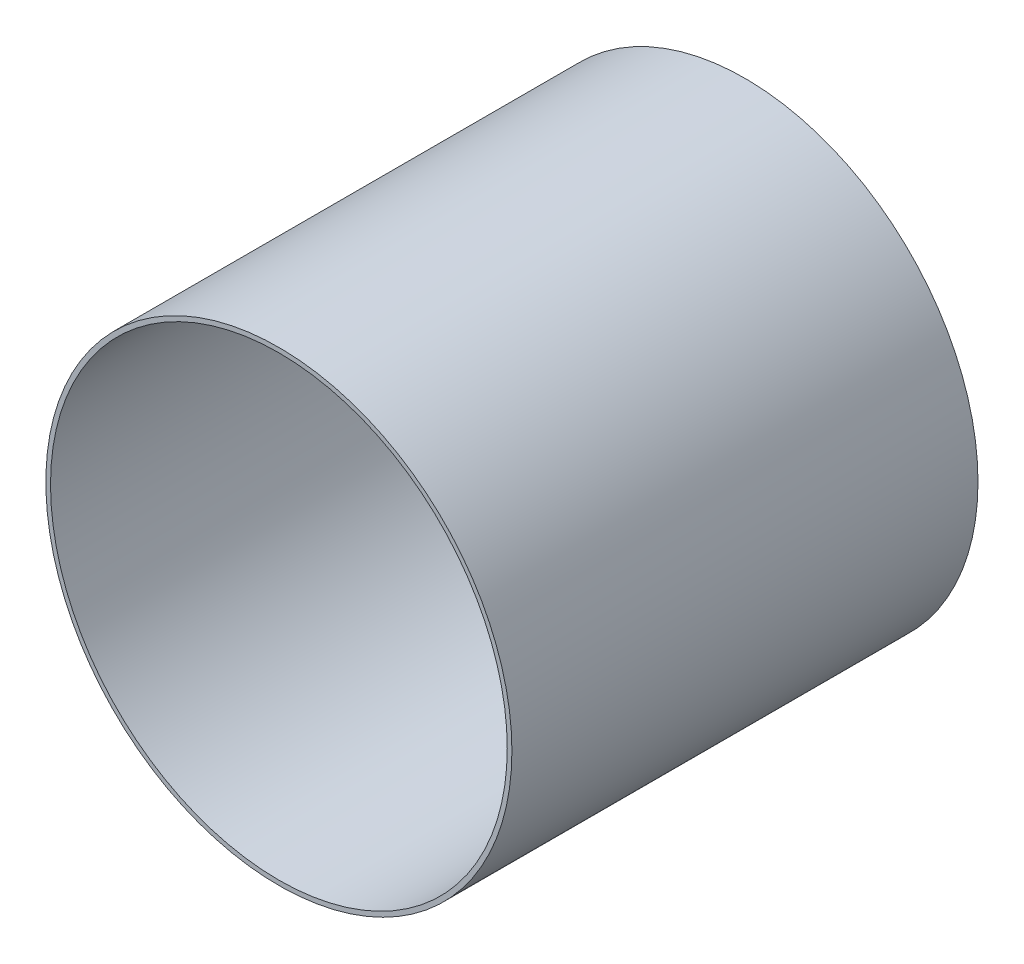
ISO-10303-21;
HEADER;
FILE_DESCRIPTION(('STEP AP214'),'2;1');
FILE_NAME('part.step','',(''),(''),'','','');
FILE_SCHEMA(('AUTOMOTIVE_DESIGN { 1 0 10303 214 1 1 1 1 }'));
ENDSEC;
DATA;
#1=APPLICATION_CONTEXT('core data for automotive mechanical design processes');
#2=APPLICATION_PROTOCOL_DEFINITION('international standard','automotive_design',2000,#1);
#3=PRODUCT_CONTEXT('',#1,'mechanical');
#4=PRODUCT('Part','Part','',(#3));
#5=PRODUCT_RELATED_PRODUCT_CATEGORY('part','',(#4));
#6=PRODUCT_DEFINITION_FORMATION('','',#4);
#7=PRODUCT_DEFINITION_CONTEXT('part definition',#1,'design');
#8=PRODUCT_DEFINITION('design','',#6,#7);
#9=PRODUCT_DEFINITION_SHAPE('','',#8);
#10=(LENGTH_UNIT() NAMED_UNIT(*) SI_UNIT(.MILLI.,.METRE.));
#11=(NAMED_UNIT(*) PLANE_ANGLE_UNIT() SI_UNIT($,.RADIAN.));
#12=(NAMED_UNIT(*) SI_UNIT($,.STERADIAN.) SOLID_ANGLE_UNIT());
#13=UNCERTAINTY_MEASURE_WITH_UNIT(LENGTH_MEASURE(1.E-05),#10,'distance_accuracy_value','');
#14=(GEOMETRIC_REPRESENTATION_CONTEXT(3) GLOBAL_UNCERTAINTY_ASSIGNED_CONTEXT((#13)) GLOBAL_UNIT_ASSIGNED_CONTEXT((#10,
#11,#12)) REPRESENTATION_CONTEXT('',''));
#15=CARTESIAN_POINT('',(0.,0.,0.));
#16=DIRECTION('',(0.,0.,1.));
#17=DIRECTION('',(1.,0.,0.));
#18=AXIS2_PLACEMENT_3D('',#15,#16,#17);
#19=CARTESIAN_POINT('',(0.,0.,-150.));
#20=DIRECTION('',(0.,0.,1.));
#21=DIRECTION('',(1.,0.,0.));
#22=AXIS2_PLACEMENT_3D('',#19,#20,#21);
#23=CYLINDRICAL_SURFACE('',#22,150.);
#24=CARTESIAN_POINT('',(0.,0.,-150.));
#25=DIRECTION('',(0.,0.,1.));
#26=DIRECTION('',(1.,0.,0.));
#27=AXIS2_PLACEMENT_3D('',#24,#25,#26);
#28=CIRCLE('',#27,150.);
#29=CARTESIAN_POINT('',(150.,0.,-150.));
#30=VERTEX_POINT('',#29);
#31=EDGE_CURVE('E10',#30,#30,#28,.T.);
#32=ORIENTED_EDGE('',*,*,#31,.T.);
#33=EDGE_LOOP('',(#32));
#34=FACE_BOUND('',#33,.T.);
#35=CARTESIAN_POINT('',(0.,0.,150.));
#36=DIRECTION('',(0.,0.,1.));
#37=DIRECTION('',(1.,0.,0.));
#38=AXIS2_PLACEMENT_3D('',#35,#36,#37);
#39=CIRCLE('',#38,150.);
#40=CARTESIAN_POINT('',(150.,0.,150.));
#41=VERTEX_POINT('',#40);
#42=EDGE_CURVE('E47',#41,#41,#39,.T.);
#43=ORIENTED_EDGE('',*,*,#42,.F.);
#44=EDGE_LOOP('',(#43));
#45=FACE_BOUND('',#44,.T.);
#46=ADVANCED_FACE('F37',(#34,#45),#23,.T.);
#47=CARTESIAN_POINT('',(0.,0.,-150.));
#48=DIRECTION('',(0.,0.,1.));
#49=DIRECTION('',(1.,0.,0.));
#50=AXIS2_PLACEMENT_3D('',#47,#48,#49);
#51=PLANE('',#50);
#52=CARTESIAN_POINT('',(0.,0.,-150.));
#53=DIRECTION('',(0.,0.,1.));
#54=DIRECTION('',(1.,0.,0.));
#55=AXIS2_PLACEMENT_3D('',#52,#53,#54);
#56=CIRCLE('',#55,147.);
#57=CARTESIAN_POINT('',(147.,0.,-150.));
#58=VERTEX_POINT('',#57);
#59=EDGE_CURVE('E43',#58,#58,#56,.T.);
#60=ORIENTED_EDGE('',*,*,#59,.T.);
#61=EDGE_LOOP('',(#60));
#62=FACE_BOUND('',#61,.T.);
#63=ORIENTED_EDGE('',*,*,#31,.F.);
#64=EDGE_LOOP('',(#63));
#65=FACE_BOUND('',#64,.T.);
#66=ADVANCED_FACE('F66',(#62,#65),#51,.F.);
#67=CARTESIAN_POINT('',(0.,0.,-150.));
#68=DIRECTION('',(0.,0.,1.));
#69=DIRECTION('',(1.,0.,0.));
#70=AXIS2_PLACEMENT_3D('',#67,#68,#69);
#71=CYLINDRICAL_SURFACE('',#70,147.);
#72=ORIENTED_EDGE('',*,*,#59,.F.);
#73=EDGE_LOOP('',(#72));
#74=FACE_BOUND('',#73,.T.);
#75=CARTESIAN_POINT('',(0.,0.,150.));
#76=DIRECTION('',(0.,0.,1.));
#77=DIRECTION('',(1.,0.,0.));
#78=AXIS2_PLACEMENT_3D('',#75,#76,#77);
#79=CIRCLE('',#78,147.);
#80=CARTESIAN_POINT('',(147.,0.,150.));
#81=VERTEX_POINT('',#80);
#82=EDGE_CURVE('E51',#81,#81,#79,.T.);
#83=ORIENTED_EDGE('',*,*,#82,.T.);
#84=EDGE_LOOP('',(#83));
#85=FACE_BOUND('',#84,.T.);
#86=ADVANCED_FACE('F57',(#74,#85),#71,.F.);
#87=CARTESIAN_POINT('',(0.,0.,150.));
#88=DIRECTION('',(0.,0.,1.));
#89=DIRECTION('',(1.,0.,0.));
#90=AXIS2_PLACEMENT_3D('',#87,#88,#89);
#91=PLANE('',#90);
#92=ORIENTED_EDGE('',*,*,#42,.T.);
#93=EDGE_LOOP('',(#92));
#94=FACE_BOUND('',#93,.T.);
#95=ORIENTED_EDGE('',*,*,#82,.F.);
#96=EDGE_LOOP('',(#95));
#97=FACE_BOUND('',#96,.T.);
#98=ADVANCED_FACE('F59',(#94,#97),#91,.T.);
#99=CLOSED_SHELL('',(#46,#66,#86,#98));
#100=MANIFOLD_SOLID_BREP('B2',#99);
#101=ADVANCED_BREP_SHAPE_REPRESENTATION('',(#18,#100),#14);
#102=SHAPE_DEFINITION_REPRESENTATION(#9,#101);
ENDSEC;
END-ISO-10303-21;
